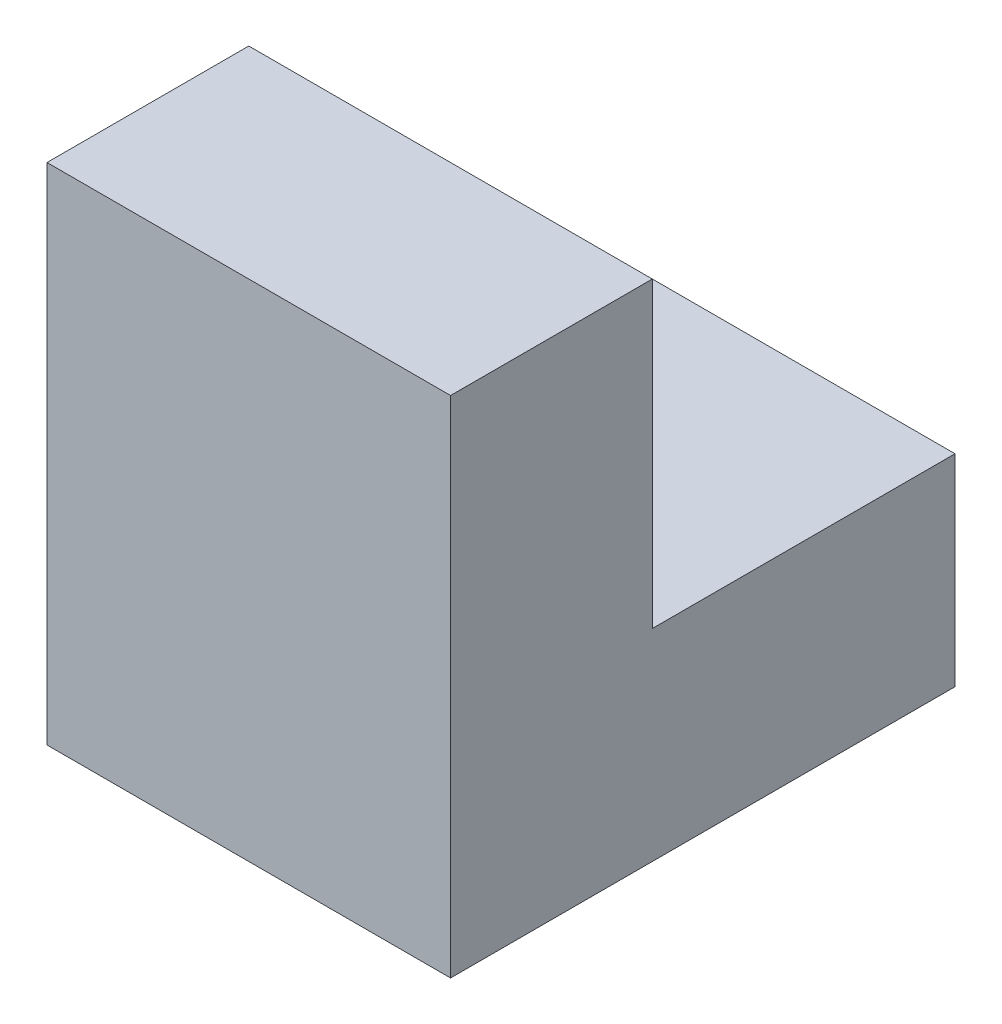
ISO-10303-21;
HEADER;
FILE_DESCRIPTION(('STEP AP214'),'2;1');
FILE_NAME('part.step','',(''),(''),'','','');
FILE_SCHEMA(('AUTOMOTIVE_DESIGN { 1 0 10303 214 1 1 1 1 }'));
ENDSEC;
DATA;
#1=APPLICATION_CONTEXT('core data for automotive mechanical design processes');
#2=APPLICATION_PROTOCOL_DEFINITION('international standard','automotive_design',2000,#1);
#3=PRODUCT_CONTEXT('',#1,'mechanical');
#4=PRODUCT('Part','Part','',(#3));
#5=PRODUCT_RELATED_PRODUCT_CATEGORY('part','',(#4));
#6=PRODUCT_DEFINITION_FORMATION('','',#4);
#7=PRODUCT_DEFINITION_CONTEXT('part definition',#1,'design');
#8=PRODUCT_DEFINITION('design','',#6,#7);
#9=PRODUCT_DEFINITION_SHAPE('','',#8);
#10=(LENGTH_UNIT() NAMED_UNIT(*) SI_UNIT(.MILLI.,.METRE.));
#11=(NAMED_UNIT(*) PLANE_ANGLE_UNIT() SI_UNIT($,.RADIAN.));
#12=(NAMED_UNIT(*) SI_UNIT($,.STERADIAN.) SOLID_ANGLE_UNIT());
#13=UNCERTAINTY_MEASURE_WITH_UNIT(LENGTH_MEASURE(1.E-05),#10,'distance_accuracy_value','');
#14=(GEOMETRIC_REPRESENTATION_CONTEXT(3) GLOBAL_UNCERTAINTY_ASSIGNED_CONTEXT((#13)) GLOBAL_UNIT_ASSIGNED_CONTEXT((#10,
#11,#12)) REPRESENTATION_CONTEXT('',''));
#15=CARTESIAN_POINT('',(0.,0.,0.));
#16=DIRECTION('',(0.,0.,1.));
#17=DIRECTION('',(1.,0.,0.));
#18=AXIS2_PLACEMENT_3D('',#15,#16,#17);
#19=CARTESIAN_POINT('',(40.,20.,-20.));
#20=DIRECTION('',(0.,0.,1.));
#21=DIRECTION('',(0.,-1.,0.));
#22=AXIS2_PLACEMENT_3D('',#19,#20,#21);
#23=PLANE('',#22);
#24=DIRECTION('',(0.,1.,0.));
#25=VECTOR('',#24,1.);
#26=CARTESIAN_POINT('',(0.,20.,-20.));
#27=LINE('',#26,#25);
#28=CARTESIAN_POINT('',(0.,20.,-20.));
#29=VERTEX_POINT('',#28);
#30=CARTESIAN_POINT('',(0.,50.,-20.));
#31=VERTEX_POINT('',#30);
#32=EDGE_CURVE('E128',#29,#31,#27,.T.);
#33=ORIENTED_EDGE('',*,*,#32,.T.);
#34=DIRECTION('',(-1.,0.,0.));
#35=VECTOR('',#34,1.);
#36=CARTESIAN_POINT('',(40.,50.,-20.));
#37=LINE('',#36,#35);
#38=CARTESIAN_POINT('',(40.,50.,-20.));
#39=VERTEX_POINT('',#38);
#40=EDGE_CURVE('E11',#39,#31,#37,.T.);
#41=ORIENTED_EDGE('',*,*,#40,.F.);
#42=DIRECTION('',(0.,1.,0.));
#43=VECTOR('',#42,1.);
#44=CARTESIAN_POINT('',(40.,20.,-20.));
#45=LINE('',#44,#43);
#46=CARTESIAN_POINT('',(40.,20.,-20.));
#47=VERTEX_POINT('',#46);
#48=EDGE_CURVE('E144',#47,#39,#45,.T.);
#49=ORIENTED_EDGE('',*,*,#48,.F.);
#50=DIRECTION('',(-1.,0.,0.));
#51=VECTOR('',#50,1.);
#52=CARTESIAN_POINT('',(40.,20.,-20.));
#53=LINE('',#52,#51);
#54=EDGE_CURVE('E124',#47,#29,#53,.T.);
#55=ORIENTED_EDGE('',*,*,#54,.T.);
#56=EDGE_LOOP('',(#33,#41,#49,#55));
#57=FACE_BOUND('',#56,.T.);
#58=ADVANCED_FACE('F39',(#57),#23,.F.);
#59=CARTESIAN_POINT('',(40.,50.,0.));
#60=DIRECTION('',(0.,-1.,0.));
#61=DIRECTION('',(0.,0.,-1.));
#62=AXIS2_PLACEMENT_3D('',#59,#60,#61);
#63=PLANE('',#62);
#64=DIRECTION('',(0.,0.,1.));
#65=VECTOR('',#64,1.);
#66=CARTESIAN_POINT('',(0.,50.,0.));
#67=LINE('',#66,#65);
#68=CARTESIAN_POINT('',(0.,50.,0.));
#69=VERTEX_POINT('',#68);
#70=EDGE_CURVE('E132',#31,#69,#67,.T.);
#71=ORIENTED_EDGE('',*,*,#70,.T.);
#72=DIRECTION('',(-1.,0.,0.));
#73=VECTOR('',#72,1.);
#74=CARTESIAN_POINT('',(40.,50.,0.));
#75=LINE('',#74,#73);
#76=CARTESIAN_POINT('',(40.,50.,0.));
#77=VERTEX_POINT('',#76);
#78=EDGE_CURVE('E48',#77,#69,#75,.T.);
#79=ORIENTED_EDGE('',*,*,#78,.F.);
#80=DIRECTION('',(0.,0.,1.));
#81=VECTOR('',#80,1.);
#82=CARTESIAN_POINT('',(40.,50.,0.));
#83=LINE('',#82,#81);
#84=EDGE_CURVE('E93',#39,#77,#83,.T.);
#85=ORIENTED_EDGE('',*,*,#84,.F.);
#86=ORIENTED_EDGE('',*,*,#40,.T.);
#87=EDGE_LOOP('',(#71,#79,#85,#86));
#88=FACE_BOUND('',#87,.T.);
#89=ADVANCED_FACE('F172',(#88),#63,.F.);
#90=CARTESIAN_POINT('',(40.,50.,0.));
#91=DIRECTION('',(0.,0.,-1.));
#92=DIRECTION('',(0.,1.,0.));
#93=AXIS2_PLACEMENT_3D('',#90,#91,#92);
#94=PLANE('',#93);
#95=DIRECTION('',(0.,-1.,0.));
#96=VECTOR('',#95,1.);
#97=CARTESIAN_POINT('',(0.,50.,0.));
#98=LINE('',#97,#96);
#99=CARTESIAN_POINT('',(0.,0.,0.));
#100=VERTEX_POINT('',#99);
#101=EDGE_CURVE('E135',#69,#100,#98,.T.);
#102=ORIENTED_EDGE('',*,*,#101,.T.);
#103=DIRECTION('',(-1.,0.,0.));
#104=VECTOR('',#103,1.);
#105=CARTESIAN_POINT('',(40.,0.,0.));
#106=LINE('',#105,#104);
#107=CARTESIAN_POINT('',(40.,0.,0.));
#108=VERTEX_POINT('',#107);
#109=EDGE_CURVE('E117',#108,#100,#106,.T.);
#110=ORIENTED_EDGE('',*,*,#109,.F.);
#111=DIRECTION('',(0.,-1.,0.));
#112=VECTOR('',#111,1.);
#113=CARTESIAN_POINT('',(40.,50.,0.));
#114=LINE('',#113,#112);
#115=EDGE_CURVE('E106',#77,#108,#114,.T.);
#116=ORIENTED_EDGE('',*,*,#115,.F.);
#117=ORIENTED_EDGE('',*,*,#78,.T.);
#118=EDGE_LOOP('',(#102,#110,#116,#117));
#119=FACE_BOUND('',#118,.T.);
#120=ADVANCED_FACE('F154',(#119),#94,.F.);
#121=CARTESIAN_POINT('',(40.,0.,0.));
#122=DIRECTION('',(0.,1.,0.));
#123=DIRECTION('',(0.,0.,1.));
#124=AXIS2_PLACEMENT_3D('',#121,#122,#123);
#125=PLANE('',#124);
#126=DIRECTION('',(0.,0.,-1.));
#127=VECTOR('',#126,1.);
#128=CARTESIAN_POINT('',(0.,0.,0.));
#129=LINE('',#128,#127);
#130=CARTESIAN_POINT('',(0.,0.,-50.));
#131=VERTEX_POINT('',#130);
#132=EDGE_CURVE('E115',#100,#131,#129,.T.);
#133=ORIENTED_EDGE('',*,*,#132,.T.);
#134=DIRECTION('',(-1.,0.,0.));
#135=VECTOR('',#134,1.);
#136=CARTESIAN_POINT('',(40.,0.,-50.));
#137=LINE('',#136,#135);
#138=CARTESIAN_POINT('',(40.,0.,-50.));
#139=VERTEX_POINT('',#138);
#140=EDGE_CURVE('E112',#139,#131,#137,.T.);
#141=ORIENTED_EDGE('',*,*,#140,.F.);
#142=DIRECTION('',(0.,0.,-1.));
#143=VECTOR('',#142,1.);
#144=CARTESIAN_POINT('',(40.,0.,0.));
#145=LINE('',#144,#143);
#146=EDGE_CURVE('E100',#108,#139,#145,.T.);
#147=ORIENTED_EDGE('',*,*,#146,.F.);
#148=ORIENTED_EDGE('',*,*,#109,.T.);
#149=EDGE_LOOP('',(#133,#141,#147,#148));
#150=FACE_BOUND('',#149,.T.);
#151=ADVANCED_FACE('F113',(#150),#125,.F.);
#152=CARTESIAN_POINT('',(40.,0.,-50.));
#153=DIRECTION('',(0.,0.,1.));
#154=DIRECTION('',(0.,-1.,0.));
#155=AXIS2_PLACEMENT_3D('',#152,#153,#154);
#156=PLANE('',#155);
#157=DIRECTION('',(0.,1.,0.));
#158=VECTOR('',#157,1.);
#159=CARTESIAN_POINT('',(0.,0.,-50.));
#160=LINE('',#159,#158);
#161=CARTESIAN_POINT('',(0.,20.,-50.));
#162=VERTEX_POINT('',#161);
#163=EDGE_CURVE('E79',#131,#162,#160,.T.);
#164=ORIENTED_EDGE('',*,*,#163,.T.);
#165=DIRECTION('',(-1.,0.,0.));
#166=VECTOR('',#165,1.);
#167=CARTESIAN_POINT('',(40.,20.,-50.));
#168=LINE('',#167,#166);
#169=CARTESIAN_POINT('',(40.,20.,-50.));
#170=VERTEX_POINT('',#169);
#171=EDGE_CURVE('E118',#170,#162,#168,.T.);
#172=ORIENTED_EDGE('',*,*,#171,.F.);
#173=DIRECTION('',(0.,1.,0.));
#174=VECTOR('',#173,1.);
#175=CARTESIAN_POINT('',(40.,0.,-50.));
#176=LINE('',#175,#174);
#177=EDGE_CURVE('E104',#139,#170,#176,.T.);
#178=ORIENTED_EDGE('',*,*,#177,.F.);
#179=ORIENTED_EDGE('',*,*,#140,.T.);
#180=EDGE_LOOP('',(#164,#172,#178,#179));
#181=FACE_BOUND('',#180,.T.);
#182=ADVANCED_FACE('F120',(#181),#156,.F.);
#183=CARTESIAN_POINT('',(40.,20.,-20.));
#184=DIRECTION('',(0.,-1.,0.));
#185=DIRECTION('',(0.,0.,-1.));
#186=AXIS2_PLACEMENT_3D('',#183,#184,#185);
#187=PLANE('',#186);
#188=DIRECTION('',(0.,0.,1.));
#189=VECTOR('',#188,1.);
#190=CARTESIAN_POINT('',(0.,20.,-20.));
#191=LINE('',#190,#189);
#192=EDGE_CURVE('E85',#162,#29,#191,.T.);
#193=ORIENTED_EDGE('',*,*,#192,.T.);
#194=ORIENTED_EDGE('',*,*,#54,.F.);
#195=DIRECTION('',(0.,0.,1.));
#196=VECTOR('',#195,1.);
#197=CARTESIAN_POINT('',(40.,20.,-20.));
#198=LINE('',#197,#196);
#199=EDGE_CURVE('E56',#170,#47,#198,.T.);
#200=ORIENTED_EDGE('',*,*,#199,.F.);
#201=ORIENTED_EDGE('',*,*,#171,.T.);
#202=EDGE_LOOP('',(#193,#194,#200,#201));
#203=FACE_BOUND('',#202,.T.);
#204=ADVANCED_FACE('F161',(#203),#187,.F.);
#205=CARTESIAN_POINT('',(40.,0.,0.));
#206=DIRECTION('',(-1.,0.,0.));
#207=DIRECTION('',(0.,0.,1.));
#208=AXIS2_PLACEMENT_3D('',#205,#206,#207);
#209=PLANE('',#208);
#210=ORIENTED_EDGE('',*,*,#48,.T.);
#211=ORIENTED_EDGE('',*,*,#84,.T.);
#212=ORIENTED_EDGE('',*,*,#115,.T.);
#213=ORIENTED_EDGE('',*,*,#146,.T.);
#214=ORIENTED_EDGE('',*,*,#177,.T.);
#215=ORIENTED_EDGE('',*,*,#199,.T.);
#216=EDGE_LOOP('',(#210,#211,#212,#213,#214,#215));
#217=FACE_BOUND('',#216,.T.);
#218=ADVANCED_FACE('F102',(#217),#209,.F.);
#219=CARTESIAN_POINT('',(0.,0.,0.));
#220=DIRECTION('',(-1.,0.,0.));
#221=DIRECTION('',(0.,0.,1.));
#222=AXIS2_PLACEMENT_3D('',#219,#220,#221);
#223=PLANE('',#222);
#224=ORIENTED_EDGE('',*,*,#32,.F.);
#225=ORIENTED_EDGE('',*,*,#192,.F.);
#226=ORIENTED_EDGE('',*,*,#163,.F.);
#227=ORIENTED_EDGE('',*,*,#132,.F.);
#228=ORIENTED_EDGE('',*,*,#101,.F.);
#229=ORIENTED_EDGE('',*,*,#70,.F.);
#230=EDGE_LOOP('',(#224,#225,#226,#227,#228,#229));
#231=FACE_BOUND('',#230,.T.);
#232=ADVANCED_FACE('F157',(#231),#223,.T.);
#233=CLOSED_SHELL('',(#58,#89,#120,#151,#182,#204,#218,#232));
#234=MANIFOLD_SOLID_BREP('B2',#233);
#235=ADVANCED_BREP_SHAPE_REPRESENTATION('',(#18,#234),#14);
#236=SHAPE_DEFINITION_REPRESENTATION(#9,#235);
ENDSEC;
END-ISO-10303-21;
